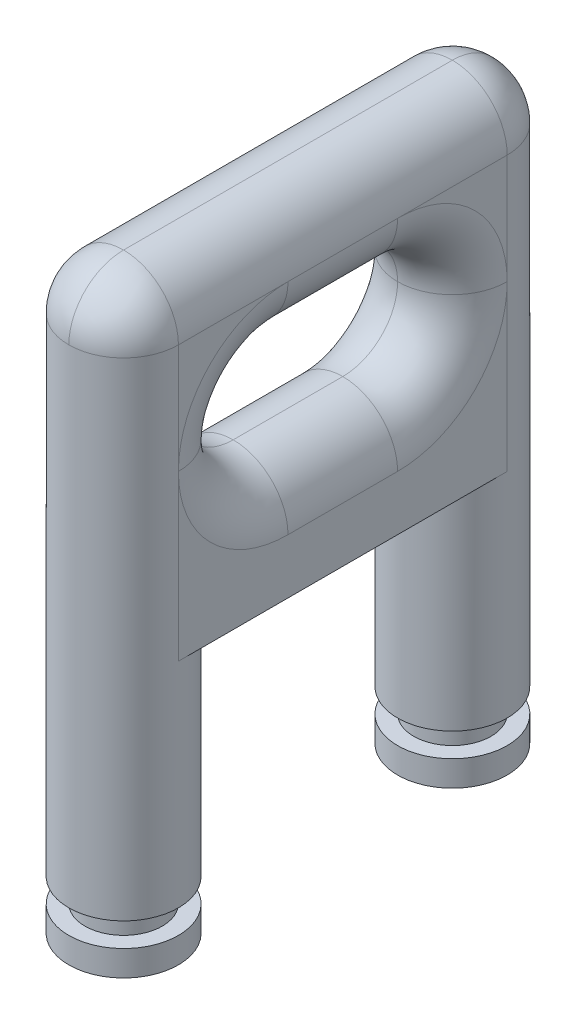
ISO-10303-21;
HEADER;
FILE_DESCRIPTION(('STEP AP214'),'2;1');
FILE_NAME('part.step','',(''),(''),'','','');
FILE_SCHEMA(('AUTOMOTIVE_DESIGN { 1 0 10303 214 1 1 1 1 }'));
ENDSEC;
DATA;
#1=APPLICATION_CONTEXT('core data for automotive mechanical design processes');
#2=APPLICATION_PROTOCOL_DEFINITION('international standard','automotive_design',2000,#1);
#3=PRODUCT_CONTEXT('',#1,'mechanical');
#4=PRODUCT('Part','Part','',(#3));
#5=PRODUCT_RELATED_PRODUCT_CATEGORY('part','',(#4));
#6=PRODUCT_DEFINITION_FORMATION('','',#4);
#7=PRODUCT_DEFINITION_CONTEXT('part definition',#1,'design');
#8=PRODUCT_DEFINITION('design','',#6,#7);
#9=PRODUCT_DEFINITION_SHAPE('','',#8);
#10=(LENGTH_UNIT() NAMED_UNIT(*) SI_UNIT(.MILLI.,.METRE.));
#11=(NAMED_UNIT(*) PLANE_ANGLE_UNIT() SI_UNIT($,.RADIAN.));
#12=(NAMED_UNIT(*) SI_UNIT($,.STERADIAN.) SOLID_ANGLE_UNIT());
#13=UNCERTAINTY_MEASURE_WITH_UNIT(LENGTH_MEASURE(1.E-05),#10,'distance_accuracy_value','');
#14=(GEOMETRIC_REPRESENTATION_CONTEXT(3) GLOBAL_UNCERTAINTY_ASSIGNED_CONTEXT((#13)) GLOBAL_UNIT_ASSIGNED_CONTEXT((#10,
#11,#12)) REPRESENTATION_CONTEXT('',''));
#15=CARTESIAN_POINT('',(0.,0.,0.));
#16=DIRECTION('',(0.,0.,1.));
#17=DIRECTION('',(1.,0.,0.));
#18=AXIS2_PLACEMENT_3D('',#15,#16,#17);
#19=CARTESIAN_POINT('',(0.,0.,-9.525));
#20=DIRECTION('',(0.,1.,0.));
#21=DIRECTION('',(0.,0.,1.));
#22=AXIS2_PLACEMENT_3D('',#19,#20,#21);
#23=CYLINDRICAL_SURFACE('',#22,3.175);
#24=DIRECTION('',(0.,1.,0.));
#25=VECTOR('',#24,1.);
#26=CARTESIAN_POINT('',(3.175,0.,-9.525));
#27=LINE('',#26,#25);
#28=CARTESIAN_POINT('',(3.175,-9.525,-9.525));
#29=VERTEX_POINT('',#28);
#30=CARTESIAN_POINT('',(3.175,0.,-9.525));
#31=VERTEX_POINT('',#30);
#32=EDGE_CURVE('E46',#29,#31,#27,.T.);
#33=ORIENTED_EDGE('',*,*,#32,.F.);
#34=CARTESIAN_POINT('',(0.,-9.525,-9.525));
#35=DIRECTION('',(0.,-1.,0.));
#36=DIRECTION('',(0.,0.,-1.));
#37=AXIS2_PLACEMENT_3D('',#34,#35,#36);
#38=CIRCLE('',#37,3.175);
#39=CARTESIAN_POINT('',(-3.175,-9.525,-9.525));
#40=VERTEX_POINT('',#39);
#41=EDGE_CURVE('E11',#29,#40,#38,.T.);
#42=ORIENTED_EDGE('',*,*,#41,.T.);
#43=DIRECTION('',(0.,1.,0.));
#44=VECTOR('',#43,1.);
#45=CARTESIAN_POINT('',(-3.175,-9.525,-9.525));
#46=LINE('',#45,#44);
#47=CARTESIAN_POINT('',(-3.175,0.,-9.525));
#48=VERTEX_POINT('',#47);
#49=EDGE_CURVE('E240',#48,#40,#46,.F.);
#50=ORIENTED_EDGE('',*,*,#49,.F.);
#51=DIRECTION('',(0.,1.,0.));
#52=VECTOR('',#51,1.);
#53=CARTESIAN_POINT('',(-3.175,-9.525,-9.525));
#54=LINE('',#53,#52);
#55=CARTESIAN_POINT('',(-3.175,6.35,-9.525));
#56=VERTEX_POINT('',#55);
#57=EDGE_CURVE('E241',#56,#48,#54,.F.);
#58=ORIENTED_EDGE('',*,*,#57,.F.);
#59=CARTESIAN_POINT('',(0.,6.35,-9.525));
#60=DIRECTION('',(0.,1.,0.));
#61=DIRECTION('',(0.,0.,1.));
#62=AXIS2_PLACEMENT_3D('',#59,#60,#61);
#63=CIRCLE('',#62,3.175);
#64=CARTESIAN_POINT('',(0.,6.35,-12.7));
#65=VERTEX_POINT('',#64);
#66=EDGE_CURVE('E351',#65,#56,#63,.T.);
#67=ORIENTED_EDGE('',*,*,#66,.F.);
#68=DIRECTION('',(0.,1.,0.));
#69=VECTOR('',#68,1.);
#70=CARTESIAN_POINT('',(0.,9.525,-12.7));
#71=LINE('',#70,#69);
#72=CARTESIAN_POINT('',(0.,-9.525,-12.7));
#73=VERTEX_POINT('',#72);
#74=EDGE_CURVE('E365',#65,#73,#71,.F.);
#75=ORIENTED_EDGE('',*,*,#74,.T.);
#76=ORIENTED_EDGE('',*,*,#74,.F.);
#77=CARTESIAN_POINT('',(0.,6.35,-9.525));
#78=DIRECTION('',(0.,1.,0.));
#79=DIRECTION('',(0.,0.,1.));
#80=AXIS2_PLACEMENT_3D('',#77,#78,#79);
#81=CIRCLE('',#80,3.175);
#82=CARTESIAN_POINT('',(3.175,6.35,-9.525));
#83=VERTEX_POINT('',#82);
#84=EDGE_CURVE('E354',#83,#65,#81,.T.);
#85=ORIENTED_EDGE('',*,*,#84,.F.);
#86=DIRECTION('',(0.,1.,0.));
#87=VECTOR('',#86,1.);
#88=CARTESIAN_POINT('',(3.175,0.,-9.525));
#89=LINE('',#88,#87);
#90=EDGE_CURVE('E271',#31,#83,#89,.T.);
#91=ORIENTED_EDGE('',*,*,#90,.F.);
#92=EDGE_LOOP('',(#33,#42,#50,#58,#67,#75,#76,#85,#91));
#93=FACE_BOUND('',#92,.T.);
#94=CARTESIAN_POINT('',(0.,-21.9006654706675,-9.525));
#95=DIRECTION('',(0.,1.,0.));
#96=DIRECTION('',(0.,0.,1.));
#97=AXIS2_PLACEMENT_3D('',#94,#95,#96);
#98=CIRCLE('',#97,3.175);
#99=CARTESIAN_POINT('',(0.,-21.9006654706675,-12.7));
#100=VERTEX_POINT('',#99);
#101=EDGE_CURVE('E213',#100,#100,#98,.T.);
#102=ORIENTED_EDGE('',*,*,#101,.T.);
#103=EDGE_LOOP('',(#102));
#104=FACE_BOUND('',#103,.T.);
#105=ADVANCED_FACE('F37',(#93,#104),#23,.T.);
#106=CARTESIAN_POINT('',(3.175,0.,0.));
#107=DIRECTION('',(1.,0.,0.));
#108=DIRECTION('',(0.,0.,-1.));
#109=AXIS2_PLACEMENT_3D('',#106,#107,#108);
#110=PLANE('',#109);
#111=DIRECTION('',(0.,0.,-1.));
#112=VECTOR('',#111,1.);
#113=CARTESIAN_POINT('',(3.175,-9.525,12.7));
#114=LINE('',#113,#112);
#115=CARTESIAN_POINT('',(3.175,-9.525,9.525));
#116=VERTEX_POINT('',#115);
#117=EDGE_CURVE('E376',#116,#29,#114,.T.);
#118=ORIENTED_EDGE('',*,*,#117,.T.);
#119=ORIENTED_EDGE('',*,*,#32,.T.);
#120=CARTESIAN_POINT('',(3.175,0.,-3.175));
#121=DIRECTION('',(1.,0.,0.));
#122=DIRECTION('',(0.,0.,-1.));
#123=AXIS2_PLACEMENT_3D('',#120,#121,#122);
#124=CIRCLE('',#123,6.35);
#125=CARTESIAN_POINT('',(3.175,-6.35,-3.175));
#126=VERTEX_POINT('',#125);
#127=EDGE_CURVE('E263',#126,#31,#124,.T.);
#128=ORIENTED_EDGE('',*,*,#127,.F.);
#129=DIRECTION('',(0.,0.,-1.));
#130=VECTOR('',#129,1.);
#131=CARTESIAN_POINT('',(3.175,-6.35,6.34999999999999));
#132=LINE('',#131,#130);
#133=CARTESIAN_POINT('',(3.175,-6.35,3.17499999999999));
#134=VERTEX_POINT('',#133);
#135=EDGE_CURVE('E261',#126,#134,#132,.F.);
#136=ORIENTED_EDGE('',*,*,#135,.T.);
#137=CARTESIAN_POINT('',(3.175,0.,3.175));
#138=DIRECTION('',(1.,0.,0.));
#139=DIRECTION('',(0.,0.,-1.));
#140=AXIS2_PLACEMENT_3D('',#137,#138,#139);
#141=CIRCLE('',#140,6.35);
#142=CARTESIAN_POINT('',(3.175,0.,9.525));
#143=VERTEX_POINT('',#142);
#144=EDGE_CURVE('E258',#143,#134,#141,.T.);
#145=ORIENTED_EDGE('',*,*,#144,.F.);
#146=DIRECTION('',(0.,-1.,0.));
#147=VECTOR('',#146,1.);
#148=CARTESIAN_POINT('',(3.175,0.,9.525));
#149=LINE('',#148,#147);
#150=EDGE_CURVE('E248',#143,#116,#149,.T.);
#151=ORIENTED_EDGE('',*,*,#150,.T.);
#152=EDGE_LOOP('',(#118,#119,#128,#136,#145,#151));
#153=FACE_BOUND('',#152,.T.);
#154=ADVANCED_FACE('F385',(#153),#110,.T.);
#155=CARTESIAN_POINT('',(3.175,0.,3.175));
#156=DIRECTION('',(1.,0.,0.));
#157=DIRECTION('',(0.,0.,-1.));
#158=AXIS2_PLACEMENT_3D('',#155,#156,#157);
#159=CIRCLE('',#158,6.35);
#160=CARTESIAN_POINT('',(3.175,6.35,3.175));
#161=VERTEX_POINT('',#160);
#162=EDGE_CURVE('E255',#161,#143,#159,.T.);
#163=ORIENTED_EDGE('',*,*,#162,.F.);
#164=DIRECTION('',(0.,0.,1.));
#165=VECTOR('',#164,1.);
#166=CARTESIAN_POINT('',(3.175,6.35,0.));
#167=LINE('',#166,#165);
#168=CARTESIAN_POINT('',(3.175,6.35,9.525));
#169=VERTEX_POINT('',#168);
#170=EDGE_CURVE('E253',#161,#169,#167,.T.);
#171=ORIENTED_EDGE('',*,*,#170,.T.);
#172=DIRECTION('',(0.,-1.,0.));
#173=VECTOR('',#172,1.);
#174=CARTESIAN_POINT('',(3.175,0.,9.525));
#175=LINE('',#174,#173);
#176=EDGE_CURVE('E250',#169,#143,#175,.T.);
#177=ORIENTED_EDGE('',*,*,#176,.T.);
#178=EDGE_LOOP('',(#163,#171,#177));
#179=FACE_BOUND('',#178,.T.);
#180=ADVANCED_FACE('F457',(#179),#110,.T.);
#181=CARTESIAN_POINT('',(-3.175,0.,0.));
#182=DIRECTION('',(1.,0.,0.));
#183=DIRECTION('',(0.,0.,-1.));
#184=AXIS2_PLACEMENT_3D('',#181,#182,#183);
#185=PLANE('',#184);
#186=CARTESIAN_POINT('',(-3.175,0.,-3.175));
#187=DIRECTION('',(1.,0.,0.));
#188=DIRECTION('',(0.,0.,-1.));
#189=AXIS2_PLACEMENT_3D('',#186,#187,#188);
#190=CIRCLE('',#189,6.35);
#191=CARTESIAN_POINT('',(-3.175,6.35,-3.175));
#192=VERTEX_POINT('',#191);
#193=EDGE_CURVE('E243',#192,#48,#190,.F.);
#194=ORIENTED_EDGE('',*,*,#193,.F.);
#195=DIRECTION('',(0.,0.,1.));
#196=VECTOR('',#195,1.);
#197=CARTESIAN_POINT('',(-3.175,6.35,-12.7));
#198=LINE('',#197,#196);
#199=EDGE_CURVE('E246',#192,#56,#198,.F.);
#200=ORIENTED_EDGE('',*,*,#199,.T.);
#201=ORIENTED_EDGE('',*,*,#57,.T.);
#202=EDGE_LOOP('',(#194,#200,#201));
#203=FACE_BOUND('',#202,.T.);
#204=ADVANCED_FACE('F459',(#203),#185,.F.);
#205=CARTESIAN_POINT('',(-3.175,0.,3.175));
#206=DIRECTION('',(1.,0.,0.));
#207=DIRECTION('',(0.,0.,-1.));
#208=AXIS2_PLACEMENT_3D('',#205,#206,#207);
#209=CIRCLE('',#208,6.35);
#210=CARTESIAN_POINT('',(-3.175,0.,9.525));
#211=VERTEX_POINT('',#210);
#212=CARTESIAN_POINT('',(-3.175,6.35,3.175));
#213=VERTEX_POINT('',#212);
#214=EDGE_CURVE('E228',#211,#213,#209,.F.);
#215=ORIENTED_EDGE('',*,*,#214,.F.);
#216=DIRECTION('',(0.,-1.,0.));
#217=VECTOR('',#216,1.);
#218=CARTESIAN_POINT('',(-3.175,9.525,9.525));
#219=LINE('',#218,#217);
#220=CARTESIAN_POINT('',(-3.175,6.35,9.525));
#221=VERTEX_POINT('',#220);
#222=EDGE_CURVE('E220',#211,#221,#219,.F.);
#223=ORIENTED_EDGE('',*,*,#222,.T.);
#224=DIRECTION('',(0.,0.,1.));
#225=VECTOR('',#224,1.);
#226=CARTESIAN_POINT('',(-3.175,6.35,-12.7));
#227=LINE('',#226,#225);
#228=EDGE_CURVE('E226',#221,#213,#227,.F.);
#229=ORIENTED_EDGE('',*,*,#228,.T.);
#230=EDGE_LOOP('',(#215,#223,#229));
#231=FACE_BOUND('',#230,.T.);
#232=ADVANCED_FACE('F465',(#231),#185,.F.);
#233=CARTESIAN_POINT('',(-3.175,-9.525,12.7));
#234=DIRECTION('',(0.,-1.,0.));
#235=DIRECTION('',(0.,0.,-1.));
#236=AXIS2_PLACEMENT_3D('',#233,#234,#235);
#237=PLANE('',#236);
#238=CARTESIAN_POINT('',(0.,-9.525,9.525));
#239=DIRECTION('',(0.,1.,0.));
#240=DIRECTION('',(0.,0.,1.));
#241=AXIS2_PLACEMENT_3D('',#238,#239,#240);
#242=CIRCLE('',#241,3.175);
#243=CARTESIAN_POINT('',(-3.175,-9.525,9.525));
#244=VERTEX_POINT('',#243);
#245=EDGE_CURVE('E186',#116,#244,#242,.T.);
#246=ORIENTED_EDGE('',*,*,#245,.T.);
#247=DIRECTION('',(0.,0.,-1.));
#248=VECTOR('',#247,1.);
#249=CARTESIAN_POINT('',(-3.175,-9.525,12.7));
#250=LINE('',#249,#248);
#251=EDGE_CURVE('E223',#244,#40,#250,.T.);
#252=ORIENTED_EDGE('',*,*,#251,.T.);
#253=ORIENTED_EDGE('',*,*,#41,.F.);
#254=ORIENTED_EDGE('',*,*,#117,.F.);
#255=EDGE_LOOP('',(#246,#252,#253,#254));
#256=FACE_BOUND('',#255,.T.);
#257=ADVANCED_FACE('F418',(#256),#237,.T.);
#258=CARTESIAN_POINT('',(-3.175,0.,-3.175));
#259=DIRECTION('',(1.,0.,0.));
#260=DIRECTION('',(0.,0.,-1.));
#261=AXIS2_PLACEMENT_3D('',#258,#259,#260);
#262=CIRCLE('',#261,6.35);
#263=CARTESIAN_POINT('',(-3.175,-6.35,-3.175));
#264=VERTEX_POINT('',#263);
#265=EDGE_CURVE('E237',#48,#264,#262,.F.);
#266=ORIENTED_EDGE('',*,*,#265,.F.);
#267=ORIENTED_EDGE('',*,*,#49,.T.);
#268=ORIENTED_EDGE('',*,*,#251,.F.);
#269=DIRECTION('',(0.,-1.,0.));
#270=VECTOR('',#269,1.);
#271=CARTESIAN_POINT('',(-3.175,9.525,9.525));
#272=LINE('',#271,#270);
#273=EDGE_CURVE('E222',#244,#211,#272,.F.);
#274=ORIENTED_EDGE('',*,*,#273,.T.);
#275=CARTESIAN_POINT('',(-3.175,0.,3.175));
#276=DIRECTION('',(1.,0.,0.));
#277=DIRECTION('',(0.,0.,-1.));
#278=AXIS2_PLACEMENT_3D('',#275,#276,#277);
#279=CIRCLE('',#278,6.35);
#280=CARTESIAN_POINT('',(-3.175,-6.35,3.17499999999999));
#281=VERTEX_POINT('',#280);
#282=EDGE_CURVE('E231',#281,#211,#279,.F.);
#283=ORIENTED_EDGE('',*,*,#282,.F.);
#284=DIRECTION('',(0.,0.,-1.));
#285=VECTOR('',#284,1.);
#286=CARTESIAN_POINT('',(-3.175,-6.35,0.));
#287=LINE('',#286,#285);
#288=EDGE_CURVE('E234',#281,#264,#287,.T.);
#289=ORIENTED_EDGE('',*,*,#288,.T.);
#290=EDGE_LOOP('',(#266,#267,#268,#274,#283,#289));
#291=FACE_BOUND('',#290,.T.);
#292=ADVANCED_FACE('F425',(#291),#185,.F.);
#293=CARTESIAN_POINT('',(3.175,0.,-3.175));
#294=DIRECTION('',(1.,0.,0.));
#295=DIRECTION('',(0.,0.,-1.));
#296=AXIS2_PLACEMENT_3D('',#293,#294,#295);
#297=CIRCLE('',#296,6.35);
#298=CARTESIAN_POINT('',(3.175,6.35,-3.175));
#299=VERTEX_POINT('',#298);
#300=EDGE_CURVE('E266',#31,#299,#297,.T.);
#301=ORIENTED_EDGE('',*,*,#300,.F.);
#302=ORIENTED_EDGE('',*,*,#90,.T.);
#303=DIRECTION('',(0.,0.,1.));
#304=VECTOR('',#303,1.);
#305=CARTESIAN_POINT('',(3.175,6.35,0.));
#306=LINE('',#305,#304);
#307=EDGE_CURVE('E269',#83,#299,#306,.T.);
#308=ORIENTED_EDGE('',*,*,#307,.T.);
#309=EDGE_LOOP('',(#301,#302,#308));
#310=FACE_BOUND('',#309,.T.);
#311=ADVANCED_FACE('F391',(#310),#110,.T.);
#312=CARTESIAN_POINT('',(0.,0.,9.525));
#313=DIRECTION('',(0.,-1.,0.));
#314=DIRECTION('',(0.,0.,-1.));
#315=AXIS2_PLACEMENT_3D('',#312,#313,#314);
#316=CYLINDRICAL_SURFACE('',#315,3.175);
#317=CARTESIAN_POINT('',(0.,-21.9006654706675,9.525));
#318=DIRECTION('',(0.,-1.,0.));
#319=DIRECTION('',(0.,0.,-1.));
#320=AXIS2_PLACEMENT_3D('',#317,#318,#319);
#321=CIRCLE('',#320,3.175);
#322=CARTESIAN_POINT('',(0.,-21.9006654706675,12.7));
#323=VERTEX_POINT('',#322);
#324=EDGE_CURVE('E61',#323,#323,#321,.T.);
#325=ORIENTED_EDGE('',*,*,#324,.F.);
#326=EDGE_LOOP('',(#325));
#327=FACE_BOUND('',#326,.T.);
#328=ORIENTED_EDGE('',*,*,#150,.F.);
#329=ORIENTED_EDGE('',*,*,#176,.F.);
#330=CARTESIAN_POINT('',(0.,6.35,9.525));
#331=DIRECTION('',(0.,1.,0.));
#332=DIRECTION('',(0.,0.,1.));
#333=AXIS2_PLACEMENT_3D('',#330,#331,#332);
#334=CIRCLE('',#333,3.175);
#335=CARTESIAN_POINT('',(0.,6.35,12.7));
#336=VERTEX_POINT('',#335);
#337=EDGE_CURVE('E359',#336,#169,#334,.T.);
#338=ORIENTED_EDGE('',*,*,#337,.F.);
#339=DIRECTION('',(0.,-1.,0.));
#340=VECTOR('',#339,1.);
#341=CARTESIAN_POINT('',(0.,9.525,12.7));
#342=LINE('',#341,#340);
#343=CARTESIAN_POINT('',(0.,-9.525,12.7));
#344=VERTEX_POINT('',#343);
#345=EDGE_CURVE('E362',#344,#336,#342,.F.);
#346=ORIENTED_EDGE('',*,*,#345,.F.);
#347=ORIENTED_EDGE('',*,*,#345,.T.);
#348=CARTESIAN_POINT('',(0.,6.35,9.525));
#349=DIRECTION('',(0.,1.,0.));
#350=DIRECTION('',(0.,0.,1.));
#351=AXIS2_PLACEMENT_3D('',#348,#349,#350);
#352=CIRCLE('',#351,3.175);
#353=EDGE_CURVE('E345',#221,#336,#352,.T.);
#354=ORIENTED_EDGE('',*,*,#353,.F.);
#355=ORIENTED_EDGE('',*,*,#222,.F.);
#356=ORIENTED_EDGE('',*,*,#273,.F.);
#357=ORIENTED_EDGE('',*,*,#245,.F.);
#358=EDGE_LOOP('',(#328,#329,#338,#346,#347,#354,#355,#356,#357));
#359=FACE_BOUND('',#358,.T.);
#360=ADVANCED_FACE('F39',(#327,#359),#316,.T.);
#361=CARTESIAN_POINT('',(0.,6.35,9.525));
#362=DIRECTION('',(0.,0.,1.));
#363=DIRECTION('',(1.,0.,0.));
#364=AXIS2_PLACEMENT_3D('',#361,#362,#363);
#365=SPHERICAL_SURFACE('',#364,3.175);
#366=CARTESIAN_POINT('',(0.,6.35,9.525));
#367=DIRECTION('',(1.,0.,0.));
#368=DIRECTION('',(0.,0.,-1.));
#369=AXIS2_PLACEMENT_3D('',#366,#367,#368);
#370=CIRCLE('',#369,3.175);
#371=CARTESIAN_POINT('',(0.,9.525,9.525));
#372=VERTEX_POINT('',#371);
#373=EDGE_CURVE('E357',#372,#336,#370,.T.);
#374=ORIENTED_EDGE('',*,*,#373,.T.);
#375=ORIENTED_EDGE('',*,*,#337,.T.);
#376=CARTESIAN_POINT('',(0.,6.35,9.525));
#377=DIRECTION('',(0.,0.,1.));
#378=DIRECTION('',(1.,0.,0.));
#379=AXIS2_PLACEMENT_3D('',#376,#377,#378);
#380=CIRCLE('',#379,3.175);
#381=EDGE_CURVE('E342',#372,#169,#380,.F.);
#382=ORIENTED_EDGE('',*,*,#381,.F.);
#383=EDGE_LOOP('',(#374,#375,#382));
#384=FACE_BOUND('',#383,.T.);
#385=ADVANCED_FACE('F524',(#384),#365,.T.);
#386=CARTESIAN_POINT('',(0.,6.35,-9.525));
#387=DIRECTION('',(0.,0.,1.));
#388=DIRECTION('',(1.,0.,0.));
#389=AXIS2_PLACEMENT_3D('',#386,#387,#388);
#390=SPHERICAL_SURFACE('',#389,3.175);
#391=ORIENTED_EDGE('',*,*,#84,.T.);
#392=CARTESIAN_POINT('',(0.,6.35,-9.525));
#393=DIRECTION('',(-1.,0.,0.));
#394=DIRECTION('',(0.,0.,1.));
#395=AXIS2_PLACEMENT_3D('',#392,#393,#394);
#396=CIRCLE('',#395,3.175);
#397=CARTESIAN_POINT('',(0.,9.525,-9.525));
#398=VERTEX_POINT('',#397);
#399=EDGE_CURVE('E348',#398,#65,#396,.T.);
#400=ORIENTED_EDGE('',*,*,#399,.F.);
#401=CARTESIAN_POINT('',(0.,6.35,-9.525));
#402=DIRECTION('',(0.,0.,-1.));
#403=DIRECTION('',(-1.,0.,0.));
#404=AXIS2_PLACEMENT_3D('',#401,#402,#403);
#405=CIRCLE('',#404,3.175);
#406=EDGE_CURVE('E339',#83,#398,#405,.F.);
#407=ORIENTED_EDGE('',*,*,#406,.F.);
#408=EDGE_LOOP('',(#391,#400,#407));
#409=FACE_BOUND('',#408,.T.);
#410=ADVANCED_FACE('F528',(#409),#390,.T.);
#411=CARTESIAN_POINT('',(0.,6.35,-9.525));
#412=DIRECTION('',(0.,0.,1.));
#413=DIRECTION('',(1.,0.,0.));
#414=AXIS2_PLACEMENT_3D('',#411,#412,#413);
#415=SPHERICAL_SURFACE('',#414,3.175);
#416=ORIENTED_EDGE('',*,*,#399,.T.);
#417=ORIENTED_EDGE('',*,*,#66,.T.);
#418=CARTESIAN_POINT('',(0.,6.35,-9.525));
#419=DIRECTION('',(0.,0.,-1.));
#420=DIRECTION('',(-1.,0.,0.));
#421=AXIS2_PLACEMENT_3D('',#418,#419,#420);
#422=CIRCLE('',#421,3.175);
#423=EDGE_CURVE('E336',#398,#56,#422,.F.);
#424=ORIENTED_EDGE('',*,*,#423,.F.);
#425=EDGE_LOOP('',(#416,#417,#424));
#426=FACE_BOUND('',#425,.T.);
#427=ADVANCED_FACE('F743',(#426),#415,.T.);
#428=CARTESIAN_POINT('',(0.,6.35,9.525));
#429=DIRECTION('',(0.,0.,1.));
#430=DIRECTION('',(1.,0.,0.));
#431=AXIS2_PLACEMENT_3D('',#428,#429,#430);
#432=SPHERICAL_SURFACE('',#431,3.175);
#433=ORIENTED_EDGE('',*,*,#353,.T.);
#434=ORIENTED_EDGE('',*,*,#373,.F.);
#435=CARTESIAN_POINT('',(0.,6.35,9.525));
#436=DIRECTION('',(0.,0.,1.));
#437=DIRECTION('',(1.,0.,0.));
#438=AXIS2_PLACEMENT_3D('',#435,#436,#437);
#439=CIRCLE('',#438,3.175);
#440=EDGE_CURVE('E330',#221,#372,#439,.F.);
#441=ORIENTED_EDGE('',*,*,#440,.F.);
#442=EDGE_LOOP('',(#433,#434,#441));
#443=FACE_BOUND('',#442,.T.);
#444=ADVANCED_FACE('F734',(#443),#432,.T.);
#445=CARTESIAN_POINT('',(0.,6.35,0.));
#446=DIRECTION('',(0.,0.,1.));
#447=DIRECTION('',(1.,0.,0.));
#448=AXIS2_PLACEMENT_3D('',#445,#446,#447);
#449=CYLINDRICAL_SURFACE('',#448,3.175);
#450=DIRECTION('',(0.,0.,1.));
#451=VECTOR('',#450,1.);
#452=CARTESIAN_POINT('',(3.175,6.35,0.));
#453=LINE('',#452,#451);
#454=EDGE_CURVE('E327',#299,#161,#453,.T.);
#455=ORIENTED_EDGE('',*,*,#454,.F.);
#456=ORIENTED_EDGE('',*,*,#307,.F.);
#457=ORIENTED_EDGE('',*,*,#406,.T.);
#458=DIRECTION('',(0.,0.,1.));
#459=VECTOR('',#458,1.);
#460=CARTESIAN_POINT('',(0.,9.525,12.7));
#461=LINE('',#460,#459);
#462=EDGE_CURVE('E333',#372,#398,#461,.F.);
#463=ORIENTED_EDGE('',*,*,#462,.F.);
#464=ORIENTED_EDGE('',*,*,#381,.T.);
#465=ORIENTED_EDGE('',*,*,#170,.F.);
#466=EDGE_LOOP('',(#455,#456,#457,#463,#464,#465));
#467=FACE_BOUND('',#466,.T.);
#468=ADVANCED_FACE('F453',(#467),#449,.T.);
#469=CARTESIAN_POINT('',(0.,6.35,6.35));
#470=DIRECTION('',(0.,0.,-1.));
#471=DIRECTION('',(0.,1.,0.));
#472=AXIS2_PLACEMENT_3D('',#469,#470,#471);
#473=CYLINDRICAL_SURFACE('',#472,3.175);
#474=CARTESIAN_POINT('',(0.,6.35,-3.175));
#475=DIRECTION('',(0.,0.,-1.));
#476=DIRECTION('',(0.,1.,0.));
#477=AXIS2_PLACEMENT_3D('',#474,#475,#476);
#478=CIRCLE('',#477,3.175);
#479=CARTESIAN_POINT('',(0.,3.175,-3.175));
#480=VERTEX_POINT('',#479);
#481=EDGE_CURVE('E325',#299,#480,#478,.T.);
#482=ORIENTED_EDGE('',*,*,#481,.F.);
#483=ORIENTED_EDGE('',*,*,#454,.T.);
#484=CARTESIAN_POINT('',(0.,6.35,3.175));
#485=DIRECTION('',(0.,0.,1.));
#486=DIRECTION('',(0.,-1.,0.));
#487=AXIS2_PLACEMENT_3D('',#484,#485,#486);
#488=CIRCLE('',#487,3.175);
#489=CARTESIAN_POINT('',(0.,3.175,3.175));
#490=VERTEX_POINT('',#489);
#491=EDGE_CURVE('E322',#490,#161,#488,.T.);
#492=ORIENTED_EDGE('',*,*,#491,.F.);
#493=DIRECTION('',(0.,0.,1.));
#494=VECTOR('',#493,1.);
#495=CARTESIAN_POINT('',(0.,3.175,6.35));
#496=LINE('',#495,#494);
#497=EDGE_CURVE('E313',#480,#490,#496,.T.);
#498=ORIENTED_EDGE('',*,*,#497,.F.);
#499=EDGE_LOOP('',(#482,#483,#492,#498));
#500=FACE_BOUND('',#499,.T.);
#501=ADVANCED_FACE('F450',(#500),#473,.T.);
#502=CARTESIAN_POINT('',(0.,0.,-3.175));
#503=DIRECTION('',(1.,0.,0.));
#504=DIRECTION('',(0.,0.,-1.));
#505=AXIS2_PLACEMENT_3D('',#502,#503,#504);
#506=TOROIDAL_SURFACE('',#505,6.35,3.175);
#507=ORIENTED_EDGE('',*,*,#300,.T.);
#508=ORIENTED_EDGE('',*,*,#481,.T.);
#509=CARTESIAN_POINT('',(0.,0.,-3.175));
#510=DIRECTION('',(1.,0.,0.));
#511=DIRECTION('',(0.,0.,-1.));
#512=AXIS2_PLACEMENT_3D('',#509,#510,#511);
#513=CIRCLE('',#512,3.175);
#514=CARTESIAN_POINT('',(0.,0.,-6.35));
#515=VERTEX_POINT('',#514);
#516=EDGE_CURVE('E310',#515,#480,#513,.T.);
#517=ORIENTED_EDGE('',*,*,#516,.F.);
#518=CARTESIAN_POINT('',(0.,0.,-9.525));
#519=DIRECTION('',(0.,1.,0.));
#520=DIRECTION('',(0.,0.,1.));
#521=AXIS2_PLACEMENT_3D('',#518,#519,#520);
#522=CIRCLE('',#521,3.175);
#523=EDGE_CURVE('E307',#31,#515,#522,.F.);
#524=ORIENTED_EDGE('',*,*,#523,.F.);
#525=EDGE_LOOP('',(#507,#508,#517,#524));
#526=FACE_BOUND('',#525,.T.);
#527=ADVANCED_FACE('F399',(#526),#506,.T.);
#528=CARTESIAN_POINT('',(0.,0.,3.175));
#529=DIRECTION('',(1.,0.,0.));
#530=DIRECTION('',(0.,0.,-1.));
#531=AXIS2_PLACEMENT_3D('',#528,#529,#530);
#532=TOROIDAL_SURFACE('',#531,6.35,3.175);
#533=CARTESIAN_POINT('',(0.,0.,3.175));
#534=DIRECTION('',(1.,0.,0.));
#535=DIRECTION('',(0.,0.,-1.));
#536=AXIS2_PLACEMENT_3D('',#533,#534,#535);
#537=CIRCLE('',#536,3.175);
#538=CARTESIAN_POINT('',(0.,0.,6.35));
#539=VERTEX_POINT('',#538);
#540=EDGE_CURVE('E319',#490,#539,#537,.T.);
#541=ORIENTED_EDGE('',*,*,#540,.F.);
#542=ORIENTED_EDGE('',*,*,#491,.T.);
#543=ORIENTED_EDGE('',*,*,#162,.T.);
#544=CARTESIAN_POINT('',(0.,0.,9.525));
#545=DIRECTION('',(0.,1.,0.));
#546=DIRECTION('',(0.,0.,1.));
#547=AXIS2_PLACEMENT_3D('',#544,#545,#546);
#548=CIRCLE('',#547,3.175);
#549=EDGE_CURVE('E304',#539,#143,#548,.F.);
#550=ORIENTED_EDGE('',*,*,#549,.F.);
#551=EDGE_LOOP('',(#541,#542,#543,#550));
#552=FACE_BOUND('',#551,.T.);
#553=ADVANCED_FACE('F444',(#552),#532,.T.);
#554=CARTESIAN_POINT('',(0.,6.35,12.7));
#555=DIRECTION('',(0.,0.,-1.));
#556=DIRECTION('',(-1.,0.,0.));
#557=AXIS2_PLACEMENT_3D('',#554,#555,#556);
#558=CYLINDRICAL_SURFACE('',#557,3.175);
#559=DIRECTION('',(0.,0.,1.));
#560=VECTOR('',#559,1.);
#561=CARTESIAN_POINT('',(-3.175,6.35,-12.7));
#562=LINE('',#561,#560);
#563=EDGE_CURVE('E316',#213,#192,#562,.F.);
#564=ORIENTED_EDGE('',*,*,#563,.F.);
#565=ORIENTED_EDGE('',*,*,#228,.F.);
#566=ORIENTED_EDGE('',*,*,#440,.T.);
#567=ORIENTED_EDGE('',*,*,#462,.T.);
#568=ORIENTED_EDGE('',*,*,#423,.T.);
#569=ORIENTED_EDGE('',*,*,#199,.F.);
#570=EDGE_LOOP('',(#564,#565,#566,#567,#568,#569));
#571=FACE_BOUND('',#570,.T.);
#572=ADVANCED_FACE('F692',(#571),#558,.T.);
#573=CARTESIAN_POINT('',(0.,6.35,0.));
#574=DIRECTION('',(0.,0.,1.));
#575=DIRECTION('',(0.,-1.,0.));
#576=AXIS2_PLACEMENT_3D('',#573,#574,#575);
#577=CYLINDRICAL_SURFACE('',#576,3.175);
#578=CARTESIAN_POINT('',(0.,6.35,-3.175));
#579=DIRECTION('',(0.,0.,-1.));
#580=DIRECTION('',(0.,1.,0.));
#581=AXIS2_PLACEMENT_3D('',#578,#579,#580);
#582=CIRCLE('',#581,3.175);
#583=EDGE_CURVE('E298',#480,#192,#582,.T.);
#584=ORIENTED_EDGE('',*,*,#583,.F.);
#585=ORIENTED_EDGE('',*,*,#497,.T.);
#586=CARTESIAN_POINT('',(0.,6.35,3.175));
#587=DIRECTION('',(0.,0.,1.));
#588=DIRECTION('',(0.,-1.,0.));
#589=AXIS2_PLACEMENT_3D('',#586,#587,#588);
#590=CIRCLE('',#589,3.175);
#591=EDGE_CURVE('E301',#213,#490,#590,.T.);
#592=ORIENTED_EDGE('',*,*,#591,.F.);
#593=ORIENTED_EDGE('',*,*,#563,.T.);
#594=EDGE_LOOP('',(#584,#585,#592,#593));
#595=FACE_BOUND('',#594,.T.);
#596=ADVANCED_FACE('F447',(#595),#577,.T.);
#597=CARTESIAN_POINT('',(0.,0.,3.175));
#598=DIRECTION('',(1.,0.,0.));
#599=DIRECTION('',(0.,0.,-1.));
#600=AXIS2_PLACEMENT_3D('',#597,#598,#599);
#601=TOROIDAL_SURFACE('',#600,6.35,3.175);
#602=ORIENTED_EDGE('',*,*,#591,.T.);
#603=ORIENTED_EDGE('',*,*,#540,.T.);
#604=CARTESIAN_POINT('',(0.,0.,9.525));
#605=DIRECTION('',(0.,1.,0.));
#606=DIRECTION('',(0.,0.,1.));
#607=AXIS2_PLACEMENT_3D('',#604,#605,#606);
#608=CIRCLE('',#607,3.175);
#609=EDGE_CURVE('E292',#211,#539,#608,.F.);
#610=ORIENTED_EDGE('',*,*,#609,.F.);
#611=ORIENTED_EDGE('',*,*,#214,.T.);
#612=EDGE_LOOP('',(#602,#603,#610,#611));
#613=FACE_BOUND('',#612,.T.);
#614=ADVANCED_FACE('F442',(#613),#601,.T.);
#615=CARTESIAN_POINT('',(0.,0.,-3.175));
#616=DIRECTION('',(1.,0.,0.));
#617=DIRECTION('',(0.,0.,-1.));
#618=AXIS2_PLACEMENT_3D('',#615,#616,#617);
#619=TOROIDAL_SURFACE('',#618,6.35,3.175);
#620=ORIENTED_EDGE('',*,*,#583,.T.);
#621=ORIENTED_EDGE('',*,*,#193,.T.);
#622=CARTESIAN_POINT('',(0.,0.,-9.525));
#623=DIRECTION('',(0.,1.,0.));
#624=DIRECTION('',(0.,0.,1.));
#625=AXIS2_PLACEMENT_3D('',#622,#623,#624);
#626=CIRCLE('',#625,3.175);
#627=EDGE_CURVE('E289',#515,#48,#626,.F.);
#628=ORIENTED_EDGE('',*,*,#627,.F.);
#629=ORIENTED_EDGE('',*,*,#516,.T.);
#630=EDGE_LOOP('',(#620,#621,#628,#629));
#631=FACE_BOUND('',#630,.T.);
#632=ADVANCED_FACE('F430',(#631),#619,.T.);
#633=CARTESIAN_POINT('',(0.,0.,-3.175));
#634=DIRECTION('',(1.,0.,0.));
#635=DIRECTION('',(0.,0.,-1.));
#636=AXIS2_PLACEMENT_3D('',#633,#634,#635);
#637=TOROIDAL_SURFACE('',#636,6.35,3.175);
#638=ORIENTED_EDGE('',*,*,#127,.T.);
#639=ORIENTED_EDGE('',*,*,#523,.T.);
#640=CARTESIAN_POINT('',(0.,0.,-3.175));
#641=DIRECTION('',(1.,0.,0.));
#642=DIRECTION('',(0.,0.,-1.));
#643=AXIS2_PLACEMENT_3D('',#640,#641,#642);
#644=CIRCLE('',#643,3.175);
#645=CARTESIAN_POINT('',(0.,-3.175,-3.175));
#646=VERTEX_POINT('',#645);
#647=EDGE_CURVE('E286',#646,#515,#644,.T.);
#648=ORIENTED_EDGE('',*,*,#647,.F.);
#649=CARTESIAN_POINT('',(0.,-6.35,-3.175));
#650=DIRECTION('',(0.,0.,-1.));
#651=DIRECTION('',(0.,1.,0.));
#652=AXIS2_PLACEMENT_3D('',#649,#650,#651);
#653=CIRCLE('',#652,3.175);
#654=EDGE_CURVE('E283',#126,#646,#653,.F.);
#655=ORIENTED_EDGE('',*,*,#654,.F.);
#656=EDGE_LOOP('',(#638,#639,#648,#655));
#657=FACE_BOUND('',#656,.T.);
#658=ADVANCED_FACE('F402',(#657),#637,.T.);
#659=CARTESIAN_POINT('',(0.,0.,3.175));
#660=DIRECTION('',(1.,0.,0.));
#661=DIRECTION('',(0.,0.,-1.));
#662=AXIS2_PLACEMENT_3D('',#659,#660,#661);
#663=TOROIDAL_SURFACE('',#662,6.35,3.175);
#664=CARTESIAN_POINT('',(0.,0.,3.175));
#665=DIRECTION('',(1.,0.,0.));
#666=DIRECTION('',(0.,0.,-1.));
#667=AXIS2_PLACEMENT_3D('',#664,#665,#666);
#668=CIRCLE('',#667,3.175);
#669=CARTESIAN_POINT('',(0.,-3.175,3.17499999999999));
#670=VERTEX_POINT('',#669);
#671=EDGE_CURVE('E295',#539,#670,#668,.T.);
#672=ORIENTED_EDGE('',*,*,#671,.F.);
#673=ORIENTED_EDGE('',*,*,#549,.T.);
#674=ORIENTED_EDGE('',*,*,#144,.T.);
#675=CARTESIAN_POINT('',(0.,-6.35,3.17499999999999));
#676=DIRECTION('',(0.,0.,1.));
#677=DIRECTION('',(0.,-1.,0.));
#678=AXIS2_PLACEMENT_3D('',#675,#676,#677);
#679=CIRCLE('',#678,3.175);
#680=EDGE_CURVE('E280',#670,#134,#679,.F.);
#681=ORIENTED_EDGE('',*,*,#680,.F.);
#682=EDGE_LOOP('',(#672,#673,#674,#681));
#683=FACE_BOUND('',#682,.T.);
#684=ADVANCED_FACE('F409',(#683),#663,.T.);
#685=CARTESIAN_POINT('',(0.,-6.35,6.34999999999999));
#686=DIRECTION('',(0.,0.,1.));
#687=DIRECTION('',(0.,-1.,0.));
#688=AXIS2_PLACEMENT_3D('',#685,#686,#687);
#689=CYLINDRICAL_SURFACE('',#688,3.175);
#690=ORIENTED_EDGE('',*,*,#135,.F.);
#691=ORIENTED_EDGE('',*,*,#654,.T.);
#692=DIRECTION('',(0.,0.,-1.));
#693=VECTOR('',#692,1.);
#694=CARTESIAN_POINT('',(0.,-3.175,-6.35));
#695=LINE('',#694,#693);
#696=EDGE_CURVE('E277',#670,#646,#695,.T.);
#697=ORIENTED_EDGE('',*,*,#696,.F.);
#698=ORIENTED_EDGE('',*,*,#680,.T.);
#699=EDGE_LOOP('',(#690,#691,#697,#698));
#700=FACE_BOUND('',#699,.T.);
#701=ADVANCED_FACE('F406',(#700),#689,.T.);
#702=CARTESIAN_POINT('',(0.,0.,3.175));
#703=DIRECTION('',(1.,0.,0.));
#704=DIRECTION('',(0.,0.,-1.));
#705=AXIS2_PLACEMENT_3D('',#702,#703,#704);
#706=TOROIDAL_SURFACE('',#705,6.35,3.175);
#707=ORIENTED_EDGE('',*,*,#609,.T.);
#708=ORIENTED_EDGE('',*,*,#671,.T.);
#709=CARTESIAN_POINT('',(0.,-6.35,3.17499999999999));
#710=DIRECTION('',(0.,0.,1.));
#711=DIRECTION('',(0.,-1.,0.));
#712=AXIS2_PLACEMENT_3D('',#709,#710,#711);
#713=CIRCLE('',#712,3.175);
#714=EDGE_CURVE('E274',#281,#670,#713,.F.);
#715=ORIENTED_EDGE('',*,*,#714,.F.);
#716=ORIENTED_EDGE('',*,*,#282,.T.);
#717=EDGE_LOOP('',(#707,#708,#715,#716));
#718=FACE_BOUND('',#717,.T.);
#719=ADVANCED_FACE('F439',(#718),#706,.T.);
#720=CARTESIAN_POINT('',(0.,0.,-3.175));
#721=DIRECTION('',(1.,0.,0.));
#722=DIRECTION('',(0.,0.,-1.));
#723=AXIS2_PLACEMENT_3D('',#720,#721,#722);
#724=TOROIDAL_SURFACE('',#723,6.35,3.175);
#725=ORIENTED_EDGE('',*,*,#627,.T.);
#726=ORIENTED_EDGE('',*,*,#265,.T.);
#727=CARTESIAN_POINT('',(0.,-6.35,-3.175));
#728=DIRECTION('',(0.,0.,-1.));
#729=DIRECTION('',(0.,1.,0.));
#730=AXIS2_PLACEMENT_3D('',#727,#728,#729);
#731=CIRCLE('',#730,3.175);
#732=EDGE_CURVE('E219',#646,#264,#731,.F.);
#733=ORIENTED_EDGE('',*,*,#732,.F.);
#734=ORIENTED_EDGE('',*,*,#647,.T.);
#735=EDGE_LOOP('',(#725,#726,#733,#734));
#736=FACE_BOUND('',#735,.T.);
#737=ADVANCED_FACE('F434',(#736),#724,.T.);
#738=CARTESIAN_POINT('',(0.,-6.35,0.));
#739=DIRECTION('',(0.,0.,-1.));
#740=DIRECTION('',(0.,1.,0.));
#741=AXIS2_PLACEMENT_3D('',#738,#739,#740);
#742=CYLINDRICAL_SURFACE('',#741,3.175);
#743=ORIENTED_EDGE('',*,*,#714,.T.);
#744=ORIENTED_EDGE('',*,*,#696,.T.);
#745=ORIENTED_EDGE('',*,*,#732,.T.);
#746=ORIENTED_EDGE('',*,*,#288,.F.);
#747=EDGE_LOOP('',(#743,#744,#745,#746));
#748=FACE_BOUND('',#747,.T.);
#749=ADVANCED_FACE('F436',(#748),#742,.T.);
#750=CARTESIAN_POINT('',(0.,-21.9006654706675,-12.7));
#751=DIRECTION('',(0.,-1.,0.));
#752=DIRECTION('',(0.,0.,-1.));
#753=AXIS2_PLACEMENT_3D('',#750,#751,#752);
#754=PLANE('',#753);
#755=CARTESIAN_POINT('',(0.,-21.9006654706675,-9.525));
#756=DIRECTION('',(0.,1.,0.));
#757=DIRECTION('',(0.,0.,1.));
#758=AXIS2_PLACEMENT_3D('',#755,#756,#757);
#759=CIRCLE('',#758,2.24201032357147);
#760=CARTESIAN_POINT('',(0.,-21.9006654706675,-11.7670103235715));
#761=VERTEX_POINT('',#760);
#762=EDGE_CURVE('E210',#761,#761,#759,.T.);
#763=ORIENTED_EDGE('',*,*,#762,.T.);
#764=EDGE_LOOP('',(#763));
#765=FACE_BOUND('',#764,.T.);
#766=ORIENTED_EDGE('',*,*,#101,.F.);
#767=EDGE_LOOP('',(#766));
#768=FACE_BOUND('',#767,.T.);
#769=ADVANCED_FACE('F494',(#765,#768),#754,.T.);
#770=CARTESIAN_POINT('',(0.,-24.765,-9.525));
#771=DIRECTION('',(0.,1.,0.));
#772=DIRECTION('',(0.,0.,1.));
#773=AXIS2_PLACEMENT_3D('',#770,#771,#772);
#774=CYLINDRICAL_SURFACE('',#773,2.24201032357147);
#775=DIRECTION('',(0.,-1.,0.));
#776=VECTOR('',#775,1.);
#777=CARTESIAN_POINT('',(0.,-23.2849668338702,-11.7670103235715));
#778=LINE('',#777,#776);
#779=CARTESIAN_POINT('',(0.,-23.2849668338702,-11.7670103235715));
#780=VERTEX_POINT('',#779);
#781=EDGE_CURVE('E199',#761,#780,#778,.T.);
#782=ORIENTED_EDGE('',*,*,#781,.F.);
#783=ORIENTED_EDGE('',*,*,#762,.F.);
#784=ORIENTED_EDGE('',*,*,#781,.T.);
#785=CARTESIAN_POINT('',(0.,-23.2849668338702,-9.525));
#786=DIRECTION('',(0.,1.,0.));
#787=DIRECTION('',(0.,0.,1.));
#788=AXIS2_PLACEMENT_3D('',#785,#786,#787);
#789=CIRCLE('',#788,2.24201032357147);
#790=EDGE_CURVE('E207',#780,#780,#789,.T.);
#791=ORIENTED_EDGE('',*,*,#790,.T.);
#792=EDGE_LOOP('',(#782,#783,#784,#791));
#793=FACE_BOUND('',#792,.T.);
#794=ADVANCED_FACE('F492',(#793),#774,.T.);
#795=CARTESIAN_POINT('',(0.,-23.2849668338702,-12.7));
#796=DIRECTION('',(0.,1.,0.));
#797=DIRECTION('',(0.,0.,1.));
#798=AXIS2_PLACEMENT_3D('',#795,#796,#797);
#799=PLANE('',#798);
#800=CARTESIAN_POINT('',(0.,-23.2849668338702,-9.525));
#801=DIRECTION('',(0.,1.,0.));
#802=DIRECTION('',(0.,0.,1.));
#803=AXIS2_PLACEMENT_3D('',#800,#801,#802);
#804=CIRCLE('',#803,3.175);
#805=CARTESIAN_POINT('',(0.,-23.2849668338702,-12.7));
#806=VERTEX_POINT('',#805);
#807=EDGE_CURVE('E205',#806,#806,#804,.T.);
#808=ORIENTED_EDGE('',*,*,#807,.T.);
#809=EDGE_LOOP('',(#808));
#810=FACE_BOUND('',#809,.T.);
#811=ORIENTED_EDGE('',*,*,#790,.F.);
#812=EDGE_LOOP('',(#811));
#813=FACE_BOUND('',#812,.T.);
#814=ADVANCED_FACE('F483',(#810,#813),#799,.T.);
#815=CARTESIAN_POINT('',(0.,-24.765,-9.525));
#816=DIRECTION('',(0.,-1.,0.));
#817=DIRECTION('',(0.,0.,-1.));
#818=AXIS2_PLACEMENT_3D('',#815,#816,#817);
#819=PLANE('',#818);
#820=CARTESIAN_POINT('',(0.,-24.765,-9.525));
#821=DIRECTION('',(0.,-1.,0.));
#822=DIRECTION('',(0.,0.,-1.));
#823=AXIS2_PLACEMENT_3D('',#820,#821,#822);
#824=CIRCLE('',#823,3.175);
#825=CARTESIAN_POINT('',(0.,-24.765,-12.7));
#826=VERTEX_POINT('',#825);
#827=EDGE_CURVE('E216',#826,#826,#824,.T.);
#828=ORIENTED_EDGE('',*,*,#827,.T.);
#829=EDGE_LOOP('',(#828));
#830=FACE_BOUND('',#829,.T.);
#831=ADVANCED_FACE('F476',(#830),#819,.T.);
#832=ORIENTED_EDGE('',*,*,#827,.F.);
#833=EDGE_LOOP('',(#832));
#834=FACE_BOUND('',#833,.T.);
#835=ORIENTED_EDGE('',*,*,#807,.F.);
#836=EDGE_LOOP('',(#835));
#837=FACE_BOUND('',#836,.T.);
#838=ADVANCED_FACE('F470',(#834,#837),#23,.T.);
#839=CARTESIAN_POINT('',(0.,-23.2849668338702,12.7));
#840=DIRECTION('',(0.,-1.,0.));
#841=DIRECTION('',(0.,0.,-1.));
#842=AXIS2_PLACEMENT_3D('',#839,#840,#841);
#843=PLANE('',#842);
#844=CARTESIAN_POINT('',(0.,-23.2849668338702,9.525));
#845=DIRECTION('',(0.,-1.,0.));
#846=DIRECTION('',(0.,0.,-1.));
#847=AXIS2_PLACEMENT_3D('',#844,#845,#846);
#848=CIRCLE('',#847,2.24201032357147);
#849=CARTESIAN_POINT('',(0.,-23.2849668338702,11.7670103235715));
#850=VERTEX_POINT('',#849);
#851=EDGE_CURVE('E178',#850,#850,#848,.T.);
#852=ORIENTED_EDGE('',*,*,#851,.T.);
#853=EDGE_LOOP('',(#852));
#854=FACE_BOUND('',#853,.T.);
#855=CARTESIAN_POINT('',(0.,-23.2849668338702,9.525));
#856=DIRECTION('',(0.,-1.,0.));
#857=DIRECTION('',(0.,0.,-1.));
#858=AXIS2_PLACEMENT_3D('',#855,#856,#857);
#859=CIRCLE('',#858,3.175);
#860=CARTESIAN_POINT('',(0.,-23.2849668338702,12.7));
#861=VERTEX_POINT('',#860);
#862=EDGE_CURVE('E182',#861,#861,#859,.T.);
#863=ORIENTED_EDGE('',*,*,#862,.F.);
#864=EDGE_LOOP('',(#863));
#865=FACE_BOUND('',#864,.T.);
#866=ADVANCED_FACE('F475',(#854,#865),#843,.F.);
#867=CARTESIAN_POINT('',(0.,-24.765,9.525));
#868=DIRECTION('',(0.,-1.,0.));
#869=DIRECTION('',(0.,0.,-1.));
#870=AXIS2_PLACEMENT_3D('',#867,#868,#869);
#871=CYLINDRICAL_SURFACE('',#870,2.24201032357147);
#872=DIRECTION('',(0.,-1.,0.));
#873=VECTOR('',#872,1.);
#874=CARTESIAN_POINT('',(0.,-23.2849668338702,11.7670103235715));
#875=LINE('',#874,#873);
#876=CARTESIAN_POINT('',(0.,-21.9006654706675,11.7670103235715));
#877=VERTEX_POINT('',#876);
#878=EDGE_CURVE('E181',#877,#850,#875,.T.);
#879=ORIENTED_EDGE('',*,*,#878,.T.);
#880=ORIENTED_EDGE('',*,*,#851,.F.);
#881=ORIENTED_EDGE('',*,*,#878,.F.);
#882=CARTESIAN_POINT('',(0.,-21.9006654706675,9.525));
#883=DIRECTION('',(0.,-1.,0.));
#884=DIRECTION('',(0.,0.,-1.));
#885=AXIS2_PLACEMENT_3D('',#882,#883,#884);
#886=CIRCLE('',#885,2.24201032357147);
#887=EDGE_CURVE('E183',#877,#877,#886,.T.);
#888=ORIENTED_EDGE('',*,*,#887,.T.);
#889=EDGE_LOOP('',(#879,#880,#881,#888));
#890=FACE_BOUND('',#889,.T.);
#891=ADVANCED_FACE('F179',(#890),#871,.T.);
#892=CARTESIAN_POINT('',(0.,-21.9006654706675,12.7));
#893=DIRECTION('',(0.,1.,0.));
#894=DIRECTION('',(0.,0.,1.));
#895=AXIS2_PLACEMENT_3D('',#892,#893,#894);
#896=PLANE('',#895);
#897=ORIENTED_EDGE('',*,*,#324,.T.);
#898=EDGE_LOOP('',(#897));
#899=FACE_BOUND('',#898,.T.);
#900=ORIENTED_EDGE('',*,*,#887,.F.);
#901=EDGE_LOOP('',(#900));
#902=FACE_BOUND('',#901,.T.);
#903=ADVANCED_FACE('F510',(#899,#902),#896,.F.);
#904=CARTESIAN_POINT('',(0.,-24.765,9.525));
#905=DIRECTION('',(0.,-1.,0.));
#906=DIRECTION('',(0.,0.,1.));
#907=AXIS2_PLACEMENT_3D('',#904,#905,#906);
#908=PLANE('',#907);
#909=CARTESIAN_POINT('',(0.,-24.765,9.525));
#910=DIRECTION('',(0.,1.,0.));
#911=DIRECTION('',(0.,0.,1.));
#912=AXIS2_PLACEMENT_3D('',#909,#910,#911);
#913=CIRCLE('',#912,3.175);
#914=CARTESIAN_POINT('',(0.,-24.765,12.7));
#915=VERTEX_POINT('',#914);
#916=EDGE_CURVE('E191',#915,#915,#913,.T.);
#917=ORIENTED_EDGE('',*,*,#916,.F.);
#918=EDGE_LOOP('',(#917));
#919=FACE_BOUND('',#918,.T.);
#920=ADVANCED_FACE('F507',(#919),#908,.T.);
#921=ORIENTED_EDGE('',*,*,#862,.T.);
#922=EDGE_LOOP('',(#921));
#923=FACE_BOUND('',#922,.T.);
#924=ORIENTED_EDGE('',*,*,#916,.T.);
#925=EDGE_LOOP('',(#924));
#926=FACE_BOUND('',#925,.T.);
#927=ADVANCED_FACE('F509',(#923,#926),#316,.T.);
#928=CLOSED_SHELL('',(#105,#154,#180,#204,#232,#257,#292,#311,#360,#385,#410,#427,#444,#468,
#501,#527,#553,#572,#596,#614,#632,#658,#684,#701,#719,#737,#749,#769,#794,#814,#831,#838,#866,
#891,#903,#920,#927));
#929=MANIFOLD_SOLID_BREP('B2',#928);
#930=ADVANCED_BREP_SHAPE_REPRESENTATION('',(#18,#929),#14);
#931=SHAPE_DEFINITION_REPRESENTATION(#9,#930);
ENDSEC;
END-ISO-10303-21;
